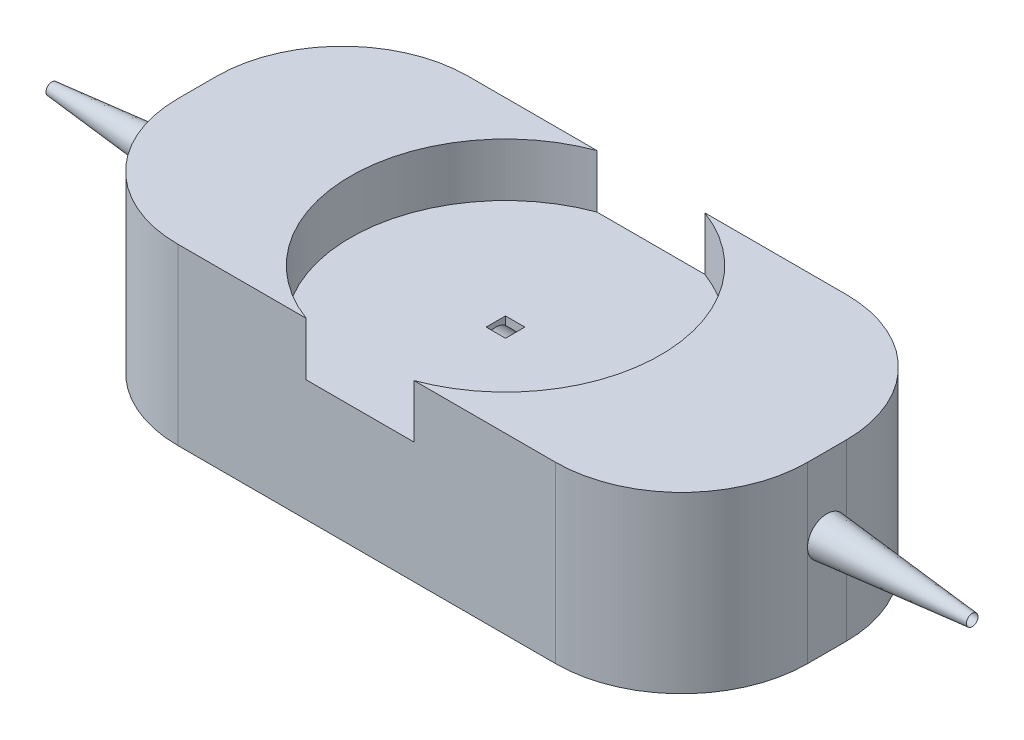
ISO-10303-21;
HEADER;
FILE_DESCRIPTION(('STEP AP214'),'2;1');
FILE_NAME('part.step','',(''),(''),'','','');
FILE_SCHEMA(('AUTOMOTIVE_DESIGN { 1 0 10303 214 1 1 1 1 }'));
ENDSEC;
DATA;
#1=APPLICATION_CONTEXT('core data for automotive mechanical design processes');
#2=APPLICATION_PROTOCOL_DEFINITION('international standard','automotive_design',2000,#1);
#3=PRODUCT_CONTEXT('',#1,'mechanical');
#4=PRODUCT('Part','Part','',(#3));
#5=PRODUCT_RELATED_PRODUCT_CATEGORY('part','',(#4));
#6=PRODUCT_DEFINITION_FORMATION('','',#4);
#7=PRODUCT_DEFINITION_CONTEXT('part definition',#1,'design');
#8=PRODUCT_DEFINITION('design','',#6,#7);
#9=PRODUCT_DEFINITION_SHAPE('','',#8);
#10=(LENGTH_UNIT() NAMED_UNIT(*) SI_UNIT(.MILLI.,.METRE.));
#11=(NAMED_UNIT(*) PLANE_ANGLE_UNIT() SI_UNIT($,.RADIAN.));
#12=(NAMED_UNIT(*) SI_UNIT($,.STERADIAN.) SOLID_ANGLE_UNIT());
#13=UNCERTAINTY_MEASURE_WITH_UNIT(LENGTH_MEASURE(1.E-05),#10,'distance_accuracy_value','');
#14=(GEOMETRIC_REPRESENTATION_CONTEXT(3) GLOBAL_UNCERTAINTY_ASSIGNED_CONTEXT((#13)) GLOBAL_UNIT_ASSIGNED_CONTEXT((#10,
#11,#12)) REPRESENTATION_CONTEXT('',''));
#15=CARTESIAN_POINT('',(0.,0.,0.));
#16=DIRECTION('',(0.,0.,1.));
#17=DIRECTION('',(1.,0.,0.));
#18=AXIS2_PLACEMENT_3D('',#15,#16,#17);
#19=CARTESIAN_POINT('',(40.001,50.4,0.));
#20=DIRECTION('',(-1.,0.,0.));
#21=DIRECTION('',(0.,0.,1.));
#22=AXIS2_PLACEMENT_3D('',#19,#20,#21);
#23=CYLINDRICAL_SURFACE('',#22,1.6);
#24=CARTESIAN_POINT('',(-25.,50.4,0.));
#25=DIRECTION('',(1.,0.,0.));
#26=DIRECTION('',(0.,0.,-1.));
#27=AXIS2_PLACEMENT_3D('',#24,#25,#26);
#28=CIRCLE('',#27,1.6);
#29=CARTESIAN_POINT('',(-25.,50.4,-1.6));
#30=VERTEX_POINT('',#29);
#31=EDGE_CURVE('E725',#30,#30,#28,.F.);
#32=ORIENTED_EDGE('',*,*,#31,.T.);
#33=EDGE_LOOP('',(#32));
#34=FACE_BOUND('',#33,.T.);
#35=DIRECTION('',(-1.,0.,0.));
#36=VECTOR('',#35,1.);
#37=CARTESIAN_POINT('',(40.001,51.6489995996798,0.999999999999832));
#38=LINE('',#37,#36);
#39=CARTESIAN_POINT('',(5.82850828649366,51.6489995996798,0.999999999999832));
#40=VERTEX_POINT('',#39);
#41=CARTESIAN_POINT('',(7.82850828649366,51.6489995996798,0.999999999999832));
#42=VERTEX_POINT('',#41);
#43=EDGE_CURVE('E256',#40,#42,#38,.F.);
#44=ORIENTED_EDGE('',*,*,#43,.T.);
#45=CARTESIAN_POINT('',(7.82850828649365,50.4,0.));
#46=DIRECTION('',(1.,0.,0.));
#47=DIRECTION('',(0.,0.,-1.));
#48=AXIS2_PLACEMENT_3D('',#45,#46,#47);
#49=CIRCLE('',#48,1.6);
#50=CARTESIAN_POINT('',(7.82850828649366,51.6489995996795,-1.00000000000017));
#51=VERTEX_POINT('',#50);
#52=EDGE_CURVE('E261',#42,#51,#49,.F.);
#53=ORIENTED_EDGE('',*,*,#52,.T.);
#54=DIRECTION('',(-1.,0.,0.));
#55=VECTOR('',#54,1.);
#56=CARTESIAN_POINT('',(40.001,51.6489995996795,-1.00000000000017));
#57=LINE('',#56,#55);
#58=CARTESIAN_POINT('',(5.82850828649366,51.6489995996795,-1.00000000000017));
#59=VERTEX_POINT('',#58);
#60=EDGE_CURVE('E248',#51,#59,#57,.T.);
#61=ORIENTED_EDGE('',*,*,#60,.T.);
#62=CARTESIAN_POINT('',(5.82850828649366,50.4,0.));
#63=DIRECTION('',(-1.,0.,0.));
#64=DIRECTION('',(0.,0.,1.));
#65=AXIS2_PLACEMENT_3D('',#62,#63,#64);
#66=CIRCLE('',#65,1.6);
#67=EDGE_CURVE('E252',#59,#40,#66,.F.);
#68=ORIENTED_EDGE('',*,*,#67,.T.);
#69=EDGE_LOOP('',(#44,#53,#61,#68));
#70=FACE_BOUND('',#69,.T.);
#71=DIRECTION('',(-1.,0.,0.));
#72=VECTOR('',#71,1.);
#73=CARTESIAN_POINT('',(40.001,49.1510004003205,-1.00000000000017));
#74=LINE('',#73,#72);
#75=CARTESIAN_POINT('',(5.82850828649366,49.1510004003205,-1.00000000000017));
#76=VERTEX_POINT('',#75);
#77=CARTESIAN_POINT('',(7.82850828649365,49.1510004003205,-1.00000000000017));
#78=VERTEX_POINT('',#77);
#79=EDGE_CURVE('E265',#76,#78,#74,.F.);
#80=ORIENTED_EDGE('',*,*,#79,.T.);
#81=CARTESIAN_POINT('',(7.82850828649366,49.1510004003202,0.999999999999832));
#82=VERTEX_POINT('',#81);
#83=EDGE_CURVE('E266',#78,#82,#49,.F.);
#84=ORIENTED_EDGE('',*,*,#83,.T.);
#85=DIRECTION('',(-1.,0.,0.));
#86=VECTOR('',#85,1.);
#87=CARTESIAN_POINT('',(40.001,49.1510004003202,0.999999999999832));
#88=LINE('',#87,#86);
#89=CARTESIAN_POINT('',(5.82850828649366,49.1510004003202,0.999999999999832));
#90=VERTEX_POINT('',#89);
#91=EDGE_CURVE('E270',#82,#90,#88,.T.);
#92=ORIENTED_EDGE('',*,*,#91,.T.);
#93=EDGE_CURVE('E257',#90,#76,#66,.F.);
#94=ORIENTED_EDGE('',*,*,#93,.T.);
#95=EDGE_LOOP('',(#80,#84,#92,#94));
#96=FACE_BOUND('',#95,.T.);
#97=CARTESIAN_POINT('',(39.9952357151676,50.4,0.));
#98=DIRECTION('',(1.,0.,0.));
#99=DIRECTION('',(0.,0.,-1.));
#100=AXIS2_PLACEMENT_3D('',#97,#98,#99);
#101=CIRCLE('',#100,1.6);
#102=CARTESIAN_POINT('',(39.9952357151676,50.4,-1.6));
#103=VERTEX_POINT('',#102);
#104=EDGE_CURVE('E56',#103,#103,#101,.F.);
#105=ORIENTED_EDGE('',*,*,#104,.F.);
#106=EDGE_LOOP('',(#105));
#107=FACE_BOUND('',#106,.T.);
#108=ADVANCED_FACE('F47',(#34,#70,#96,#107),#23,.F.);
#109=CARTESIAN_POINT('',(-25.,58.,15.));
#110=DIRECTION('',(1.,0.,0.));
#111=DIRECTION('',(0.,0.,-1.));
#112=AXIS2_PLACEMENT_3D('',#109,#110,#111);
#113=PLANE('',#112);
#114=DIRECTION('',(0.,-1.,0.));
#115=VECTOR('',#114,1.);
#116=CARTESIAN_POINT('',(-25.,58.,-1.99999999999999));
#117=LINE('',#116,#115);
#118=CARTESIAN_POINT('',(-25.,58.,-1.99999999999999));
#119=VERTEX_POINT('',#118);
#120=CARTESIAN_POINT('',(-25.,50.4,-1.99999999999999));
#121=VERTEX_POINT('',#120);
#122=EDGE_CURVE('E205',#119,#121,#117,.T.);
#123=ORIENTED_EDGE('',*,*,#122,.T.);
#124=CARTESIAN_POINT('',(-25.,50.4,0.));
#125=DIRECTION('',(1.,0.,0.));
#126=DIRECTION('',(0.,0.,-1.));
#127=AXIS2_PLACEMENT_3D('',#124,#125,#126);
#128=CIRCLE('',#127,2.);
#129=CARTESIAN_POINT('',(-25.,50.4,2.00000000000001));
#130=VERTEX_POINT('',#129);
#131=EDGE_CURVE('E62',#121,#130,#128,.T.);
#132=ORIENTED_EDGE('',*,*,#131,.T.);
#133=DIRECTION('',(0.,-1.,0.));
#134=VECTOR('',#133,1.);
#135=CARTESIAN_POINT('',(-25.,58.,2.00000000000001));
#136=LINE('',#135,#134);
#137=CARTESIAN_POINT('',(-25.,58.,2.00000000000001));
#138=VERTEX_POINT('',#137);
#139=EDGE_CURVE('E202',#130,#138,#136,.F.);
#140=ORIENTED_EDGE('',*,*,#139,.T.);
#141=DIRECTION('',(0.,0.,1.));
#142=VECTOR('',#141,1.);
#143=CARTESIAN_POINT('',(-25.,58.,15.));
#144=LINE('',#143,#142);
#145=EDGE_CURVE('E375',#119,#138,#144,.T.);
#146=ORIENTED_EDGE('',*,*,#145,.F.);
#147=EDGE_LOOP('',(#123,#132,#140,#146));
#148=FACE_BOUND('',#147,.T.);
#149=ADVANCED_FACE('F200',(#148),#113,.F.);
#150=CARTESIAN_POINT('',(0.,58.,0.));
#151=DIRECTION('',(0.,-1.,0.));
#152=DIRECTION('',(0.,0.,-1.));
#153=AXIS2_PLACEMENT_3D('',#150,#151,#152);
#154=PLANE('',#153);
#155=DIRECTION('',(-1.,0.,0.));
#156=VECTOR('',#155,1.);
#157=CARTESIAN_POINT('',(-25.,58.,-15.));
#158=LINE('',#157,#156);
#159=CARTESIAN_POINT('',(27.,58.,-15.));
#160=VERTEX_POINT('',#159);
#161=CARTESIAN_POINT('',(12.3962726493241,58.,-15.));
#162=VERTEX_POINT('',#161);
#163=EDGE_CURVE('E371',#160,#162,#158,.T.);
#164=ORIENTED_EDGE('',*,*,#163,.T.);
#165=CARTESIAN_POINT('',(6.82850828649366,58.,-1.6826817716975E-13));
#166=DIRECTION('',(0.,1.,0.));
#167=DIRECTION('',(0.,0.,1.));
#168=AXIS2_PLACEMENT_3D('',#165,#166,#167);
#169=CIRCLE('',#168,16.);
#170=CARTESIAN_POINT('',(12.3962726493232,58.,15.));
#171=VERTEX_POINT('',#170);
#172=EDGE_CURVE('E296',#171,#162,#169,.T.);
#173=ORIENTED_EDGE('',*,*,#172,.F.);
#174=DIRECTION('',(1.,0.,0.));
#175=VECTOR('',#174,1.);
#176=CARTESIAN_POINT('',(-25.,58.,15.));
#177=LINE('',#176,#175);
#178=CARTESIAN_POINT('',(27.,58.,15.));
#179=VERTEX_POINT('',#178);
#180=EDGE_CURVE('E378',#171,#179,#177,.T.);
#181=ORIENTED_EDGE('',*,*,#180,.T.);
#182=CARTESIAN_POINT('',(27.,58.,2.00000000000001));
#183=DIRECTION('',(0.,-1.,0.));
#184=DIRECTION('',(0.,0.,-1.));
#185=AXIS2_PLACEMENT_3D('',#182,#183,#184);
#186=CIRCLE('',#185,13.);
#187=CARTESIAN_POINT('',(40.,58.,2.00000000000001));
#188=VERTEX_POINT('',#187);
#189=EDGE_CURVE('E400',#179,#188,#186,.F.);
#190=ORIENTED_EDGE('',*,*,#189,.T.);
#191=DIRECTION('',(0.,0.,-1.));
#192=VECTOR('',#191,1.);
#193=CARTESIAN_POINT('',(40.,58.,15.));
#194=LINE('',#193,#192);
#195=CARTESIAN_POINT('',(40.,58.,-2.));
#196=VERTEX_POINT('',#195);
#197=EDGE_CURVE('E366',#188,#196,#194,.T.);
#198=ORIENTED_EDGE('',*,*,#197,.T.);
#199=CARTESIAN_POINT('',(27.,58.,-2.));
#200=DIRECTION('',(0.,-1.,0.));
#201=DIRECTION('',(0.,0.,-1.));
#202=AXIS2_PLACEMENT_3D('',#199,#200,#201);
#203=CIRCLE('',#202,13.);
#204=EDGE_CURVE('E216',#196,#160,#203,.F.);
#205=ORIENTED_EDGE('',*,*,#204,.T.);
#206=EDGE_LOOP('',(#164,#173,#181,#190,#198,#205));
#207=FACE_BOUND('',#206,.T.);
#208=ADVANCED_FACE('F410',(#207),#154,.F.);
#209=CARTESIAN_POINT('',(40.,58.,15.));
#210=DIRECTION('',(-1.,0.,0.));
#211=DIRECTION('',(0.,0.,1.));
#212=AXIS2_PLACEMENT_3D('',#209,#210,#211);
#213=PLANE('',#212);
#214=CARTESIAN_POINT('',(40.,50.4,0.));
#215=DIRECTION('',(-1.,0.,0.));
#216=DIRECTION('',(0.,0.,1.));
#217=AXIS2_PLACEMENT_3D('',#214,#215,#216);
#218=CIRCLE('',#217,1.99955533341565);
#219=CARTESIAN_POINT('',(40.,50.4,1.99955533341565));
#220=VERTEX_POINT('',#219);
#221=EDGE_CURVE('E11',#220,#220,#218,.F.);
#222=ORIENTED_EDGE('',*,*,#221,.F.);
#223=EDGE_LOOP('',(#222));
#224=FACE_BOUND('',#223,.T.);
#225=DIRECTION('',(0.,0.,1.));
#226=VECTOR('',#225,1.);
#227=CARTESIAN_POINT('',(40.,40.,15.));
#228=LINE('',#227,#226);
#229=CARTESIAN_POINT('',(40.,40.,-2.));
#230=VERTEX_POINT('',#229);
#231=CARTESIAN_POINT('',(40.,40.,2.00000000000001));
#232=VERTEX_POINT('',#231);
#233=EDGE_CURVE('E359',#230,#232,#228,.T.);
#234=ORIENTED_EDGE('',*,*,#233,.F.);
#235=DIRECTION('',(0.,-1.,0.));
#236=VECTOR('',#235,1.);
#237=CARTESIAN_POINT('',(40.,58.,-2.));
#238=LINE('',#237,#236);
#239=EDGE_CURVE('E395',#230,#196,#238,.F.);
#240=ORIENTED_EDGE('',*,*,#239,.T.);
#241=ORIENTED_EDGE('',*,*,#197,.F.);
#242=DIRECTION('',(0.,-1.,0.));
#243=VECTOR('',#242,1.);
#244=CARTESIAN_POINT('',(40.,58.,2.00000000000001));
#245=LINE('',#244,#243);
#246=EDGE_CURVE('E391',#188,#232,#245,.T.);
#247=ORIENTED_EDGE('',*,*,#246,.T.);
#248=EDGE_LOOP('',(#234,#240,#241,#247));
#249=FACE_BOUND('',#248,.T.);
#250=ADVANCED_FACE('F425',(#224,#249),#213,.F.);
#251=CARTESIAN_POINT('',(-25.,58.,-15.));
#252=DIRECTION('',(0.,0.,1.));
#253=DIRECTION('',(1.,0.,0.));
#254=AXIS2_PLACEMENT_3D('',#251,#252,#253);
#255=PLANE('',#254);
#256=DIRECTION('',(-1.,0.,0.));
#257=VECTOR('',#256,1.);
#258=CARTESIAN_POINT('',(-25.,52.5,-15.));
#259=LINE('',#258,#257);
#260=CARTESIAN_POINT('',(12.3962726493241,52.5,-15.));
#261=VERTEX_POINT('',#260);
#262=CARTESIAN_POINT('',(1.26074392366317,52.5,-15.));
#263=VERTEX_POINT('',#262);
#264=EDGE_CURVE('E340',#261,#263,#259,.T.);
#265=ORIENTED_EDGE('',*,*,#264,.F.);
#266=DIRECTION('',(0.,1.,0.));
#267=VECTOR('',#266,1.);
#268=CARTESIAN_POINT('',(12.3962726493241,52.5,-15.));
#269=LINE('',#268,#267);
#270=EDGE_CURVE('E336',#261,#162,#269,.T.);
#271=ORIENTED_EDGE('',*,*,#270,.T.);
#272=ORIENTED_EDGE('',*,*,#163,.F.);
#273=DIRECTION('',(0.,-1.,0.));
#274=VECTOR('',#273,1.);
#275=CARTESIAN_POINT('',(27.,58.,-15.));
#276=LINE('',#275,#274);
#277=CARTESIAN_POINT('',(27.,40.,-15.));
#278=VERTEX_POINT('',#277);
#279=EDGE_CURVE('E387',#160,#278,#276,.T.);
#280=ORIENTED_EDGE('',*,*,#279,.T.);
#281=DIRECTION('',(1.,0.,0.));
#282=VECTOR('',#281,1.);
#283=CARTESIAN_POINT('',(-25.,40.,-15.));
#284=LINE('',#283,#282);
#285=CARTESIAN_POINT('',(-12.,40.,-15.));
#286=VERTEX_POINT('',#285);
#287=EDGE_CURVE('E356',#286,#278,#284,.T.);
#288=ORIENTED_EDGE('',*,*,#287,.F.);
#289=DIRECTION('',(0.,-1.,0.));
#290=VECTOR('',#289,1.);
#291=CARTESIAN_POINT('',(-12.,58.,-15.));
#292=LINE('',#291,#290);
#293=CARTESIAN_POINT('',(-12.,58.,-15.));
#294=VERTEX_POINT('',#293);
#295=EDGE_CURVE('E383',#286,#294,#292,.F.);
#296=ORIENTED_EDGE('',*,*,#295,.T.);
#297=CARTESIAN_POINT('',(1.26074392366317,58.,-15.));
#298=VERTEX_POINT('',#297);
#299=EDGE_CURVE('E370',#298,#294,#158,.T.);
#300=ORIENTED_EDGE('',*,*,#299,.F.);
#301=DIRECTION('',(0.,1.,0.));
#302=VECTOR('',#301,1.);
#303=CARTESIAN_POINT('',(1.26074392366316,52.5,-15.));
#304=LINE('',#303,#302);
#305=EDGE_CURVE('E332',#298,#263,#304,.F.);
#306=ORIENTED_EDGE('',*,*,#305,.T.);
#307=EDGE_LOOP('',(#265,#271,#272,#280,#288,#296,#300,#306));
#308=FACE_BOUND('',#307,.T.);
#309=ADVANCED_FACE('F418',(#308),#255,.F.);
#310=CARTESIAN_POINT('',(-25.,40.,2.00000000000001));
#311=VERTEX_POINT('',#310);
#312=EDGE_CURVE('E212',#311,#130,#136,.F.);
#313=ORIENTED_EDGE('',*,*,#312,.T.);
#314=EDGE_CURVE('E189',#130,#121,#128,.T.);
#315=ORIENTED_EDGE('',*,*,#314,.T.);
#316=CARTESIAN_POINT('',(-25.,40.,-1.99999999999999));
#317=VERTEX_POINT('',#316);
#318=EDGE_CURVE('E223',#121,#317,#117,.T.);
#319=ORIENTED_EDGE('',*,*,#318,.T.);
#320=DIRECTION('',(0.,0.,-1.));
#321=VECTOR('',#320,1.);
#322=CARTESIAN_POINT('',(-25.,40.,15.));
#323=LINE('',#322,#321);
#324=EDGE_CURVE('E221',#311,#317,#323,.T.);
#325=ORIENTED_EDGE('',*,*,#324,.F.);
#326=EDGE_LOOP('',(#313,#315,#319,#325));
#327=FACE_BOUND('',#326,.T.);
#328=ADVANCED_FACE('F219',(#327),#113,.F.);
#329=CARTESIAN_POINT('',(-25.,58.,15.));
#330=DIRECTION('',(0.,0.,-1.));
#331=DIRECTION('',(-1.,0.,0.));
#332=AXIS2_PLACEMENT_3D('',#329,#330,#331);
#333=PLANE('',#332);
#334=DIRECTION('',(1.,0.,0.));
#335=VECTOR('',#334,1.);
#336=CARTESIAN_POINT('',(-25.,52.5,15.));
#337=LINE('',#336,#335);
#338=CARTESIAN_POINT('',(1.2607439236641,52.5,15.));
#339=VERTEX_POINT('',#338);
#340=CARTESIAN_POINT('',(12.3962726493232,52.5,15.));
#341=VERTEX_POINT('',#340);
#342=EDGE_CURVE('E245',#339,#341,#337,.T.);
#343=ORIENTED_EDGE('',*,*,#342,.F.);
#344=DIRECTION('',(0.,1.,0.));
#345=VECTOR('',#344,1.);
#346=CARTESIAN_POINT('',(1.26074392366409,52.5,15.));
#347=LINE('',#346,#345);
#348=CARTESIAN_POINT('',(1.2607439236641,58.,15.));
#349=VERTEX_POINT('',#348);
#350=EDGE_CURVE('E328',#339,#349,#347,.T.);
#351=ORIENTED_EDGE('',*,*,#350,.T.);
#352=CARTESIAN_POINT('',(-12.,58.,15.));
#353=VERTEX_POINT('',#352);
#354=EDGE_CURVE('E379',#353,#349,#177,.T.);
#355=ORIENTED_EDGE('',*,*,#354,.F.);
#356=DIRECTION('',(0.,-1.,0.));
#357=VECTOR('',#356,1.);
#358=CARTESIAN_POINT('',(-12.,58.,15.));
#359=LINE('',#358,#357);
#360=CARTESIAN_POINT('',(-12.,40.,15.));
#361=VERTEX_POINT('',#360);
#362=EDGE_CURVE('E230',#353,#361,#359,.T.);
#363=ORIENTED_EDGE('',*,*,#362,.T.);
#364=DIRECTION('',(-1.,0.,0.));
#365=VECTOR('',#364,1.);
#366=CARTESIAN_POINT('',(-25.,40.,15.));
#367=LINE('',#366,#365);
#368=CARTESIAN_POINT('',(27.,40.,15.));
#369=VERTEX_POINT('',#368);
#370=EDGE_CURVE('E343',#369,#361,#367,.T.);
#371=ORIENTED_EDGE('',*,*,#370,.F.);
#372=DIRECTION('',(0.,-1.,0.));
#373=VECTOR('',#372,1.);
#374=CARTESIAN_POINT('',(27.,58.,15.));
#375=LINE('',#374,#373);
#376=EDGE_CURVE('E234',#369,#179,#375,.F.);
#377=ORIENTED_EDGE('',*,*,#376,.T.);
#378=ORIENTED_EDGE('',*,*,#180,.F.);
#379=DIRECTION('',(0.,1.,0.));
#380=VECTOR('',#379,1.);
#381=CARTESIAN_POINT('',(12.3962726493232,52.5,15.));
#382=LINE('',#381,#380);
#383=EDGE_CURVE('E323',#171,#341,#382,.F.);
#384=ORIENTED_EDGE('',*,*,#383,.T.);
#385=EDGE_LOOP('',(#343,#351,#355,#363,#371,#377,#378,#384));
#386=FACE_BOUND('',#385,.T.);
#387=ADVANCED_FACE('F434',(#386),#333,.F.);
#388=CARTESIAN_POINT('',(27.,58.,-2.));
#389=DIRECTION('',(0.,-1.,0.));
#390=DIRECTION('',(0.,0.,-1.));
#391=AXIS2_PLACEMENT_3D('',#388,#389,#390);
#392=CYLINDRICAL_SURFACE('',#391,13.);
#393=ORIENTED_EDGE('',*,*,#239,.F.);
#394=CARTESIAN_POINT('',(27.,40.,-2.));
#395=DIRECTION('',(0.,-1.,0.));
#396=DIRECTION('',(0.,0.,-1.));
#397=AXIS2_PLACEMENT_3D('',#394,#395,#396);
#398=CIRCLE('',#397,13.);
#399=EDGE_CURVE('E362',#230,#278,#398,.F.);
#400=ORIENTED_EDGE('',*,*,#399,.T.);
#401=ORIENTED_EDGE('',*,*,#279,.F.);
#402=ORIENTED_EDGE('',*,*,#204,.F.);
#403=EDGE_LOOP('',(#393,#400,#401,#402));
#404=FACE_BOUND('',#403,.T.);
#405=ADVANCED_FACE('F420',(#404),#392,.T.);
#406=CARTESIAN_POINT('',(-12.,58.,-1.99999999999999));
#407=DIRECTION('',(0.,-1.,0.));
#408=DIRECTION('',(0.,0.,-1.));
#409=AXIS2_PLACEMENT_3D('',#406,#407,#408);
#410=CYLINDRICAL_SURFACE('',#409,13.);
#411=ORIENTED_EDGE('',*,*,#295,.F.);
#412=CARTESIAN_POINT('',(-12.,40.,-1.99999999999999));
#413=DIRECTION('',(0.,-1.,0.));
#414=DIRECTION('',(0.,0.,-1.));
#415=AXIS2_PLACEMENT_3D('',#412,#413,#414);
#416=CIRCLE('',#415,13.);
#417=EDGE_CURVE('E352',#286,#317,#416,.F.);
#418=ORIENTED_EDGE('',*,*,#417,.T.);
#419=ORIENTED_EDGE('',*,*,#318,.F.);
#420=ORIENTED_EDGE('',*,*,#122,.F.);
#421=CARTESIAN_POINT('',(-12.,58.,-1.99999999999999));
#422=DIRECTION('',(0.,-1.,0.));
#423=DIRECTION('',(0.,0.,-1.));
#424=AXIS2_PLACEMENT_3D('',#421,#422,#423);
#425=CIRCLE('',#424,13.);
#426=EDGE_CURVE('E402',#294,#119,#425,.F.);
#427=ORIENTED_EDGE('',*,*,#426,.F.);
#428=EDGE_LOOP('',(#411,#418,#419,#420,#427));
#429=FACE_BOUND('',#428,.T.);
#430=ADVANCED_FACE('F439',(#429),#410,.T.);
#431=CARTESIAN_POINT('',(27.,58.,2.00000000000001));
#432=DIRECTION('',(0.,-1.,0.));
#433=DIRECTION('',(0.,0.,-1.));
#434=AXIS2_PLACEMENT_3D('',#431,#432,#433);
#435=CYLINDRICAL_SURFACE('',#434,13.);
#436=ORIENTED_EDGE('',*,*,#376,.F.);
#437=CARTESIAN_POINT('',(27.,40.,2.00000000000001));
#438=DIRECTION('',(0.,-1.,0.));
#439=DIRECTION('',(0.,0.,-1.));
#440=AXIS2_PLACEMENT_3D('',#437,#438,#439);
#441=CIRCLE('',#440,13.);
#442=EDGE_CURVE('E348',#369,#232,#441,.F.);
#443=ORIENTED_EDGE('',*,*,#442,.T.);
#444=ORIENTED_EDGE('',*,*,#246,.F.);
#445=ORIENTED_EDGE('',*,*,#189,.F.);
#446=EDGE_LOOP('',(#436,#443,#444,#445));
#447=FACE_BOUND('',#446,.T.);
#448=ADVANCED_FACE('F430',(#447),#435,.T.);
#449=CARTESIAN_POINT('',(-12.,58.,2.00000000000001));
#450=DIRECTION('',(0.,-1.,0.));
#451=DIRECTION('',(0.,0.,-1.));
#452=AXIS2_PLACEMENT_3D('',#449,#450,#451);
#453=CYLINDRICAL_SURFACE('',#452,13.);
#454=ORIENTED_EDGE('',*,*,#312,.F.);
#455=CARTESIAN_POINT('',(-12.,40.,2.00000000000001));
#456=DIRECTION('',(0.,-1.,0.));
#457=DIRECTION('',(0.,0.,-1.));
#458=AXIS2_PLACEMENT_3D('',#455,#456,#457);
#459=CIRCLE('',#458,13.);
#460=EDGE_CURVE('E238',#311,#361,#459,.F.);
#461=ORIENTED_EDGE('',*,*,#460,.T.);
#462=ORIENTED_EDGE('',*,*,#362,.F.);
#463=CARTESIAN_POINT('',(-12.,58.,2.00000000000001));
#464=DIRECTION('',(0.,-1.,0.));
#465=DIRECTION('',(0.,0.,-1.));
#466=AXIS2_PLACEMENT_3D('',#463,#464,#465);
#467=CIRCLE('',#466,13.);
#468=EDGE_CURVE('E214',#138,#353,#467,.F.);
#469=ORIENTED_EDGE('',*,*,#468,.F.);
#470=ORIENTED_EDGE('',*,*,#139,.F.);
#471=EDGE_LOOP('',(#454,#461,#462,#469,#470));
#472=FACE_BOUND('',#471,.T.);
#473=ADVANCED_FACE('F49',(#472),#453,.T.);
#474=ORIENTED_EDGE('',*,*,#354,.T.);
#475=CARTESIAN_POINT('',(6.82850828649366,58.,-1.6826817716975E-13));
#476=DIRECTION('',(0.,-1.,0.));
#477=DIRECTION('',(0.,0.,-1.));
#478=AXIS2_PLACEMENT_3D('',#475,#476,#477);
#479=CIRCLE('',#478,16.);
#480=EDGE_CURVE('E241',#349,#298,#479,.T.);
#481=ORIENTED_EDGE('',*,*,#480,.T.);
#482=ORIENTED_EDGE('',*,*,#299,.T.);
#483=ORIENTED_EDGE('',*,*,#426,.T.);
#484=ORIENTED_EDGE('',*,*,#145,.T.);
#485=ORIENTED_EDGE('',*,*,#468,.T.);
#486=EDGE_LOOP('',(#474,#481,#482,#483,#484,#485));
#487=FACE_BOUND('',#486,.T.);
#488=ADVANCED_FACE('F533',(#487),#154,.F.);
#489=CARTESIAN_POINT('',(0.,40.,0.));
#490=DIRECTION('',(0.,-1.,0.));
#491=DIRECTION('',(0.,0.,-1.));
#492=AXIS2_PLACEMENT_3D('',#489,#490,#491);
#493=PLANE('',#492);
#494=ORIENTED_EDGE('',*,*,#233,.T.);
#495=ORIENTED_EDGE('',*,*,#442,.F.);
#496=ORIENTED_EDGE('',*,*,#370,.T.);
#497=ORIENTED_EDGE('',*,*,#460,.F.);
#498=ORIENTED_EDGE('',*,*,#324,.T.);
#499=ORIENTED_EDGE('',*,*,#417,.F.);
#500=ORIENTED_EDGE('',*,*,#287,.T.);
#501=ORIENTED_EDGE('',*,*,#399,.F.);
#502=EDGE_LOOP('',(#494,#495,#496,#497,#498,#499,#500,#501));
#503=FACE_BOUND('',#502,.T.);
#504=ADVANCED_FACE('F423',(#503),#493,.T.);
#505=CARTESIAN_POINT('',(6.82850828649366,52.5,-1.6826817716975E-13));
#506=DIRECTION('',(0.,1.,0.));
#507=DIRECTION('',(0.,0.,1.));
#508=AXIS2_PLACEMENT_3D('',#505,#506,#507);
#509=PLANE('',#508);
#510=DIRECTION('',(0.,0.,-1.));
#511=VECTOR('',#510,1.);
#512=CARTESIAN_POINT('',(7.82850828649366,52.5,0.999999999999832));
#513=LINE('',#512,#511);
#514=CARTESIAN_POINT('',(7.82850828649366,52.5,0.999999999999832));
#515=VERTEX_POINT('',#514);
#516=CARTESIAN_POINT('',(7.82850828649366,52.5,-1.00000000000017));
#517=VERTEX_POINT('',#516);
#518=EDGE_CURVE('E70',#515,#517,#513,.T.);
#519=ORIENTED_EDGE('',*,*,#518,.F.);
#520=DIRECTION('',(1.,0.,0.));
#521=VECTOR('',#520,1.);
#522=CARTESIAN_POINT('',(5.82850828649366,52.5,0.999999999999832));
#523=LINE('',#522,#521);
#524=CARTESIAN_POINT('',(5.82850828649366,52.5,0.999999999999832));
#525=VERTEX_POINT('',#524);
#526=EDGE_CURVE('E306',#525,#515,#523,.T.);
#527=ORIENTED_EDGE('',*,*,#526,.F.);
#528=DIRECTION('',(0.,0.,1.));
#529=VECTOR('',#528,1.);
#530=CARTESIAN_POINT('',(5.82850828649366,52.5,0.999999999999832));
#531=LINE('',#530,#529);
#532=CARTESIAN_POINT('',(5.82850828649366,52.5,-1.00000000000017));
#533=VERTEX_POINT('',#532);
#534=EDGE_CURVE('E720',#533,#525,#531,.T.);
#535=ORIENTED_EDGE('',*,*,#534,.F.);
#536=DIRECTION('',(-1.,0.,0.));
#537=VECTOR('',#536,1.);
#538=CARTESIAN_POINT('',(5.82850828649366,52.5,-1.00000000000017));
#539=LINE('',#538,#537);
#540=EDGE_CURVE('E723',#517,#533,#539,.T.);
#541=ORIENTED_EDGE('',*,*,#540,.F.);
#542=EDGE_LOOP('',(#519,#527,#535,#541));
#543=FACE_BOUND('',#542,.T.);
#544=ORIENTED_EDGE('',*,*,#264,.T.);
#545=CARTESIAN_POINT('',(6.82850828649366,52.5,-1.6826817716975E-13));
#546=DIRECTION('',(0.,1.,0.));
#547=DIRECTION('',(0.,0.,1.));
#548=AXIS2_PLACEMENT_3D('',#545,#546,#547);
#549=CIRCLE('',#548,16.);
#550=EDGE_CURVE('E301',#263,#339,#549,.T.);
#551=ORIENTED_EDGE('',*,*,#550,.T.);
#552=ORIENTED_EDGE('',*,*,#342,.T.);
#553=EDGE_CURVE('E320',#341,#261,#549,.T.);
#554=ORIENTED_EDGE('',*,*,#553,.T.);
#555=EDGE_LOOP('',(#544,#551,#552,#554));
#556=FACE_BOUND('',#555,.T.);
#557=ADVANCED_FACE('F446',(#543,#556),#509,.T.);
#558=CARTESIAN_POINT('',(6.82850828649366,52.5,-1.6826817716975E-13));
#559=DIRECTION('',(0.,1.,0.));
#560=DIRECTION('',(0.,0.,1.));
#561=AXIS2_PLACEMENT_3D('',#558,#559,#560);
#562=CYLINDRICAL_SURFACE('',#561,16.);
#563=ORIENTED_EDGE('',*,*,#553,.F.);
#564=ORIENTED_EDGE('',*,*,#383,.F.);
#565=ORIENTED_EDGE('',*,*,#172,.T.);
#566=ORIENTED_EDGE('',*,*,#270,.F.);
#567=EDGE_LOOP('',(#563,#564,#565,#566));
#568=FACE_BOUND('',#567,.T.);
#569=ADVANCED_FACE('F450',(#568),#562,.F.);
#570=ORIENTED_EDGE('',*,*,#480,.F.);
#571=ORIENTED_EDGE('',*,*,#350,.F.);
#572=ORIENTED_EDGE('',*,*,#550,.F.);
#573=ORIENTED_EDGE('',*,*,#305,.F.);
#574=EDGE_LOOP('',(#570,#571,#572,#573));
#575=FACE_BOUND('',#574,.T.);
#576=ADVANCED_FACE('F453',(#575),#562,.F.);
#577=CARTESIAN_POINT('',(5.82850828649366,44.5,-1.00000000000017));
#578=DIRECTION('',(0.,0.,-1.));
#579=DIRECTION('',(-1.,0.,0.));
#580=AXIS2_PLACEMENT_3D('',#577,#578,#579);
#581=PLANE('',#580);
#582=DIRECTION('',(0.,1.,0.));
#583=VECTOR('',#582,1.);
#584=CARTESIAN_POINT('',(7.82850828649366,44.5,-1.00000000000017));
#585=LINE('',#584,#583);
#586=EDGE_CURVE('E319',#51,#517,#585,.T.);
#587=ORIENTED_EDGE('',*,*,#586,.T.);
#588=ORIENTED_EDGE('',*,*,#540,.T.);
#589=DIRECTION('',(0.,1.,0.));
#590=VECTOR('',#589,1.);
#591=CARTESIAN_POINT('',(5.82850828649366,44.5,-1.00000000000017));
#592=LINE('',#591,#590);
#593=EDGE_CURVE('E316',#59,#533,#592,.T.);
#594=ORIENTED_EDGE('',*,*,#593,.F.);
#595=ORIENTED_EDGE('',*,*,#60,.F.);
#596=EDGE_LOOP('',(#587,#588,#594,#595));
#597=FACE_BOUND('',#596,.T.);
#598=ADVANCED_FACE('F459',(#597),#581,.F.);
#599=CARTESIAN_POINT('',(5.82850828649366,44.5,0.999999999999832));
#600=DIRECTION('',(-1.,0.,0.));
#601=DIRECTION('',(0.,0.,1.));
#602=AXIS2_PLACEMENT_3D('',#599,#600,#601);
#603=PLANE('',#602);
#604=ORIENTED_EDGE('',*,*,#593,.T.);
#605=ORIENTED_EDGE('',*,*,#534,.T.);
#606=DIRECTION('',(0.,1.,0.));
#607=VECTOR('',#606,1.);
#608=CARTESIAN_POINT('',(5.82850828649366,44.5,0.999999999999832));
#609=LINE('',#608,#607);
#610=EDGE_CURVE('E311',#40,#525,#609,.T.);
#611=ORIENTED_EDGE('',*,*,#610,.F.);
#612=ORIENTED_EDGE('',*,*,#67,.F.);
#613=EDGE_LOOP('',(#604,#605,#611,#612));
#614=FACE_BOUND('',#613,.T.);
#615=ADVANCED_FACE('F489',(#614),#603,.F.);
#616=CARTESIAN_POINT('',(5.82850828649366,44.5,0.999999999999832));
#617=DIRECTION('',(0.,0.,1.));
#618=DIRECTION('',(1.,0.,0.));
#619=AXIS2_PLACEMENT_3D('',#616,#617,#618);
#620=PLANE('',#619);
#621=ORIENTED_EDGE('',*,*,#610,.T.);
#622=ORIENTED_EDGE('',*,*,#526,.T.);
#623=DIRECTION('',(0.,1.,0.));
#624=VECTOR('',#623,1.);
#625=CARTESIAN_POINT('',(7.82850828649366,44.5,0.999999999999832));
#626=LINE('',#625,#624);
#627=EDGE_CURVE('E297',#42,#515,#626,.T.);
#628=ORIENTED_EDGE('',*,*,#627,.F.);
#629=ORIENTED_EDGE('',*,*,#43,.F.);
#630=EDGE_LOOP('',(#621,#622,#628,#629));
#631=FACE_BOUND('',#630,.T.);
#632=ADVANCED_FACE('F490',(#631),#620,.F.);
#633=CARTESIAN_POINT('',(7.82850828649366,44.5,0.999999999999832));
#634=DIRECTION('',(1.,0.,0.));
#635=DIRECTION('',(0.,0.,-1.));
#636=AXIS2_PLACEMENT_3D('',#633,#634,#635);
#637=PLANE('',#636);
#638=ORIENTED_EDGE('',*,*,#627,.T.);
#639=ORIENTED_EDGE('',*,*,#518,.T.);
#640=ORIENTED_EDGE('',*,*,#586,.F.);
#641=ORIENTED_EDGE('',*,*,#52,.F.);
#642=EDGE_LOOP('',(#638,#639,#640,#641));
#643=FACE_BOUND('',#642,.T.);
#644=ADVANCED_FACE('F479',(#643),#637,.F.);
#645=CARTESIAN_POINT('',(7.82850828649366,44.5,-1.00000000000017));
#646=VERTEX_POINT('',#645);
#647=EDGE_CURVE('E287',#646,#78,#585,.T.);
#648=ORIENTED_EDGE('',*,*,#647,.F.);
#649=DIRECTION('',(0.,0.,-1.));
#650=VECTOR('',#649,1.);
#651=CARTESIAN_POINT('',(7.82850828649366,44.5,0.999999999999832));
#652=LINE('',#651,#650);
#653=CARTESIAN_POINT('',(7.82850828649366,44.5,0.999999999999832));
#654=VERTEX_POINT('',#653);
#655=EDGE_CURVE('E291',#654,#646,#652,.T.);
#656=ORIENTED_EDGE('',*,*,#655,.F.);
#657=EDGE_CURVE('E289',#654,#82,#626,.T.);
#658=ORIENTED_EDGE('',*,*,#657,.T.);
#659=ORIENTED_EDGE('',*,*,#83,.F.);
#660=EDGE_LOOP('',(#648,#656,#658,#659));
#661=FACE_BOUND('',#660,.T.);
#662=ADVANCED_FACE('F285',(#661),#637,.F.);
#663=ORIENTED_EDGE('',*,*,#657,.F.);
#664=DIRECTION('',(1.,0.,0.));
#665=VECTOR('',#664,1.);
#666=CARTESIAN_POINT('',(5.82850828649366,44.5,0.999999999999832));
#667=LINE('',#666,#665);
#668=CARTESIAN_POINT('',(5.82850828649366,44.5,0.999999999999832));
#669=VERTEX_POINT('',#668);
#670=EDGE_CURVE('E732',#669,#654,#667,.T.);
#671=ORIENTED_EDGE('',*,*,#670,.F.);
#672=EDGE_CURVE('E303',#669,#90,#609,.T.);
#673=ORIENTED_EDGE('',*,*,#672,.T.);
#674=ORIENTED_EDGE('',*,*,#91,.F.);
#675=EDGE_LOOP('',(#663,#671,#673,#674));
#676=FACE_BOUND('',#675,.T.);
#677=ADVANCED_FACE('F478',(#676),#620,.F.);
#678=ORIENTED_EDGE('',*,*,#672,.F.);
#679=DIRECTION('',(0.,0.,1.));
#680=VECTOR('',#679,1.);
#681=CARTESIAN_POINT('',(5.82850828649366,44.5,0.999999999999832));
#682=LINE('',#681,#680);
#683=CARTESIAN_POINT('',(5.82850828649366,44.5,-1.00000000000017));
#684=VERTEX_POINT('',#683);
#685=EDGE_CURVE('E739',#684,#669,#682,.T.);
#686=ORIENTED_EDGE('',*,*,#685,.F.);
#687=EDGE_CURVE('E312',#684,#76,#592,.T.);
#688=ORIENTED_EDGE('',*,*,#687,.T.);
#689=ORIENTED_EDGE('',*,*,#93,.F.);
#690=EDGE_LOOP('',(#678,#686,#688,#689));
#691=FACE_BOUND('',#690,.T.);
#692=ADVANCED_FACE('F484',(#691),#603,.F.);
#693=ORIENTED_EDGE('',*,*,#687,.F.);
#694=DIRECTION('',(-1.,0.,0.));
#695=VECTOR('',#694,1.);
#696=CARTESIAN_POINT('',(5.82850828649366,44.5,-1.00000000000017));
#697=LINE('',#696,#695);
#698=EDGE_CURVE('E742',#646,#684,#697,.T.);
#699=ORIENTED_EDGE('',*,*,#698,.F.);
#700=ORIENTED_EDGE('',*,*,#647,.T.);
#701=ORIENTED_EDGE('',*,*,#79,.F.);
#702=EDGE_LOOP('',(#693,#699,#700,#701));
#703=FACE_BOUND('',#702,.T.);
#704=ADVANCED_FACE('F480',(#703),#581,.F.);
#705=CARTESIAN_POINT('',(0.,44.5,0.));
#706=DIRECTION('',(0.,-1.,0.));
#707=DIRECTION('',(0.,0.,-1.));
#708=AXIS2_PLACEMENT_3D('',#705,#706,#707);
#709=PLANE('',#708);
#710=ORIENTED_EDGE('',*,*,#655,.T.);
#711=ORIENTED_EDGE('',*,*,#698,.T.);
#712=ORIENTED_EDGE('',*,*,#685,.T.);
#713=ORIENTED_EDGE('',*,*,#670,.T.);
#714=EDGE_LOOP('',(#710,#711,#712,#713));
#715=FACE_BOUND('',#714,.T.);
#716=ADVANCED_FACE('F483',(#715),#709,.F.);
#717=CARTESIAN_POINT('',(-25.,51.,0.));
#718=DIRECTION('',(1.,0.,0.));
#719=DIRECTION('',(0.,0.,-1.));
#720=AXIS2_PLACEMENT_3D('',#717,#718,#719);
#721=PLANE('',#720);
#722=CARTESIAN_POINT('',(-25.,50.4,0.));
#723=DIRECTION('',(1.,0.,0.));
#724=DIRECTION('',(0.,0.,-1.));
#725=AXIS2_PLACEMENT_3D('',#722,#723,#724);
#726=CIRCLE('',#725,0.600000000000003);
#727=CARTESIAN_POINT('',(-25.,50.4,-0.600000000000003));
#728=VERTEX_POINT('',#727);
#729=EDGE_CURVE('E207',#728,#728,#726,.T.);
#730=ORIENTED_EDGE('',*,*,#729,.F.);
#731=EDGE_LOOP('',(#730));
#732=FACE_BOUND('',#731,.T.);
#733=ORIENTED_EDGE('',*,*,#31,.F.);
#734=EDGE_LOOP('',(#733));
#735=FACE_BOUND('',#734,.T.);
#736=ADVANCED_FACE('F496',(#732,#735),#721,.T.);
#737=CARTESIAN_POINT('',(-25.,50.4,0.));
#738=DIRECTION('',(1.,0.,0.));
#739=DIRECTION('',(0.,0.,-1.));
#740=AXIS2_PLACEMENT_3D('',#737,#738,#739);
#741=CYLINDRICAL_SURFACE('',#740,0.600000000000003);
#742=ORIENTED_EDGE('',*,*,#729,.T.);
#743=EDGE_LOOP('',(#742));
#744=FACE_BOUND('',#743,.T.);
#745=CARTESIAN_POINT('',(-40.,50.4,0.));
#746=DIRECTION('',(1.,0.,0.));
#747=DIRECTION('',(0.,0.,-1.));
#748=AXIS2_PLACEMENT_3D('',#745,#746,#747);
#749=CIRCLE('',#748,0.600000000000003);
#750=CARTESIAN_POINT('',(-40.,50.4,-0.600000000000003));
#751=VERTEX_POINT('',#750);
#752=EDGE_CURVE('E195',#751,#751,#749,.T.);
#753=ORIENTED_EDGE('',*,*,#752,.F.);
#754=EDGE_LOOP('',(#753));
#755=FACE_BOUND('',#754,.T.);
#756=ADVANCED_FACE('F498',(#744,#755),#741,.F.);
#757=CARTESIAN_POINT('',(-25.,50.4,0.));
#758=DIRECTION('',(1.,0.,0.));
#759=DIRECTION('',(0.,0.,-1.));
#760=AXIS2_PLACEMENT_3D('',#757,#758,#759);
#761=CONICAL_SURFACE('',#760,2.,0.0930637287244178);
#762=ORIENTED_EDGE('',*,*,#752,.T.);
#763=EDGE_LOOP('',(#762));
#764=FACE_BOUND('',#763,.T.);
#765=ORIENTED_EDGE('',*,*,#131,.F.);
#766=ORIENTED_EDGE('',*,*,#314,.F.);
#767=EDGE_LOOP('',(#765,#766));
#768=FACE_BOUND('',#767,.T.);
#769=ADVANCED_FACE('F190',(#764,#768),#761,.T.);
#770=CARTESIAN_POINT('',(54.9952357151676,50.4,0.));
#771=DIRECTION('',(-1.,0.,0.));
#772=DIRECTION('',(0.,0.,1.));
#773=AXIS2_PLACEMENT_3D('',#770,#771,#772);
#774=CONICAL_SURFACE('',#773,0.600000000000003,0.0930637287244179);
#775=CARTESIAN_POINT('',(54.9952357151676,50.4,0.));
#776=DIRECTION('',(-1.,0.,0.));
#777=DIRECTION('',(0.,0.,1.));
#778=AXIS2_PLACEMENT_3D('',#775,#776,#777);
#779=CIRCLE('',#778,0.600000000000003);
#780=CARTESIAN_POINT('',(54.9952357151676,50.4,0.600000000000003));
#781=VERTEX_POINT('',#780);
#782=EDGE_CURVE('E523',#781,#781,#779,.T.);
#783=CARTESIAN_POINT('',(54.9952357151676,50.4,0.600000000000003));
#784=CARTESIAN_POINT('',(54.8390353431346,50.4,0.61457870138975));
#785=CARTESIAN_POINT('',(54.6828349711016,50.4,0.629157402779496));
#786=CARTESIAN_POINT('',(54.3704342270356,50.4,0.658314805558988));
#787=CARTESIAN_POINT('',(54.2142338550026,50.4,0.672893506948734));
#788=CARTESIAN_POINT('',(53.9018331109366,50.4,0.702050909728227));
#789=CARTESIAN_POINT('',(53.7456327389036,50.4,0.716629611117973));
#790=CARTESIAN_POINT('',(53.4332319948376,50.4,0.745787013897466));
#791=CARTESIAN_POINT('',(53.2770316228046,50.4,0.760365715287212));
#792=CARTESIAN_POINT('',(52.9646308787387,50.4,0.789523118066705));
#793=CARTESIAN_POINT('',(52.8084305067057,50.4,0.804101819456451));
#794=CARTESIAN_POINT('',(52.4960297626397,50.4,0.833259222235944));
#795=CARTESIAN_POINT('',(52.3398293906067,50.4,0.84783792362569));
#796=CARTESIAN_POINT('',(52.0274286465407,50.4,0.876995326405182));
#797=CARTESIAN_POINT('',(51.8712282745077,50.4,0.891574027794929));
#798=CARTESIAN_POINT('',(51.5588275304417,50.4,0.920731430574421));
#799=CARTESIAN_POINT('',(51.4026271584087,50.4,0.935310131964168));
#800=CARTESIAN_POINT('',(51.0902264143427,50.4,0.96446753474366));
#801=CARTESIAN_POINT('',(50.9340260423097,50.4,0.979046236133406));
#802=CARTESIAN_POINT('',(50.6216252982437,50.4,1.0082036389129));
#803=CARTESIAN_POINT('',(50.4654249262107,50.4,1.02278234030265));
#804=CARTESIAN_POINT('',(50.1530241821447,50.4,1.05193974308214));
#805=CARTESIAN_POINT('',(49.9968238101117,50.4,1.06651844447188));
#806=CARTESIAN_POINT('',(49.6844230660457,50.4,1.09567584725138));
#807=CARTESIAN_POINT('',(49.5282226940127,50.4,1.11025454864112));
#808=CARTESIAN_POINT('',(49.2158219499468,50.4,1.13941195142062));
#809=CARTESIAN_POINT('',(49.0596215779138,50.4,1.15399065281036));
#810=CARTESIAN_POINT('',(48.7472208338478,50.4,1.18314805558985));
#811=CARTESIAN_POINT('',(48.5910204618148,50.4,1.1977267569796));
#812=CARTESIAN_POINT('',(48.2786197177488,50.4,1.22688415975909));
#813=CARTESIAN_POINT('',(48.1224193457158,50.4,1.24146286114884));
#814=CARTESIAN_POINT('',(47.8100186016498,50.4,1.27062026392833));
#815=CARTESIAN_POINT('',(47.6538182296168,50.4,1.28519896531808));
#816=CARTESIAN_POINT('',(47.3414174855508,50.4,1.31435636809757));
#817=CARTESIAN_POINT('',(47.1852171135178,50.4,1.32893506948732));
#818=CARTESIAN_POINT('',(46.8728163694518,50.4,1.35809247226681));
#819=CARTESIAN_POINT('',(46.7166159974188,50.4,1.37267117365656));
#820=CARTESIAN_POINT('',(46.4042152533528,50.4,1.40182857643605));
#821=CARTESIAN_POINT('',(46.2480148813198,50.4,1.41640727782579));
#822=CARTESIAN_POINT('',(45.9356141372538,50.4,1.44556468060529));
#823=CARTESIAN_POINT('',(45.7794137652209,50.4,1.46014338199503));
#824=CARTESIAN_POINT('',(45.4670130211549,50.4,1.48930078477453));
#825=CARTESIAN_POINT('',(45.3108126491219,50.4,1.50387948616427));
#826=CARTESIAN_POINT('',(44.9984119050559,50.4,1.53303688894377));
#827=CARTESIAN_POINT('',(44.8422115330229,50.4,1.54761559033351));
#828=CARTESIAN_POINT('',(44.5298107889569,50.4,1.576772993113));
#829=CARTESIAN_POINT('',(44.3736104169239,50.4,1.59135169450275));
#830=CARTESIAN_POINT('',(44.0612096728579,50.4,1.62050909728224));
#831=CARTESIAN_POINT('',(43.9050093008249,50.4,1.63508779867199));
#832=CARTESIAN_POINT('',(43.5926085567589,50.4,1.66424520145148));
#833=CARTESIAN_POINT('',(43.4364081847259,50.4,1.67882390284123));
#834=CARTESIAN_POINT('',(43.1240074406599,50.4,1.70798130562072));
#835=CARTESIAN_POINT('',(42.9678070686269,50.4,1.72256000701047));
#836=CARTESIAN_POINT('',(42.6554063245609,50.4,1.75171740978996));
#837=CARTESIAN_POINT('',(42.4992059525279,50.4,1.76629611117971));
#838=CARTESIAN_POINT('',(42.1868052084619,50.4,1.7954535139592));
#839=CARTESIAN_POINT('',(42.0306048364289,50.4,1.81003221534894));
#840=CARTESIAN_POINT('',(41.718204092363,50.4,1.83918961812844));
#841=CARTESIAN_POINT('',(41.56200372033,50.4,1.85376831951818));
#842=CARTESIAN_POINT('',(41.249602976264,50.4,1.88292572229768));
#843=CARTESIAN_POINT('',(41.093402604231,50.4,1.89750442368742));
#844=CARTESIAN_POINT('',(40.781001860165,50.4,1.92666182646691));
#845=CARTESIAN_POINT('',(40.624801488132,50.4,1.94124052785666));
#846=CARTESIAN_POINT('',(40.312400744066,50.4,1.97039793063615));
#847=CARTESIAN_POINT('',(40.156200372033,50.4,1.9849766320259));
#848=CARTESIAN_POINT('',(40.,50.4,1.99955533341565));
#849=B_SPLINE_CURVE_WITH_KNOTS('',3,(#783,#784,#785,#786,#787,#788,#789,#790,#791,#792,#793,
#794,#795,#796,#797,#798,#799,#800,#801,#802,#803,#804,#805,#806,#807,#808,#809,#810,#811,#812,
#813,#814,#815,#816,#817,#818,#819,#820,#821,#822,#823,#824,#825,#826,#827,#828,#829,#830,#831,
#832,#833,#834,#835,#836,#837,#838,#839,#840,#841,#842,#843,#844,#845,#846,#847,#848),
.UNSPECIFIED.,.F.,.F.,(4,2,2,2,2,2,2,2,2,2,2,2,2,2,2,2,2,2,2,2,2,2,2,2,2,2,2,2,2,2,2,2,4),(0.,
0.470637708664654,0.941275417329315,1.41191312599397,1.88255083465863,2.35318854332328,
2.82382625198794,3.2944639606526,3.76510166931726,4.23573937798192,4.70637708664657,
5.17701479531124,5.6476525039759,6.11829021264055,6.58892792130521,7.05956562996987,
7.53020333863453,8.00084104729919,8.47147875596384,8.9421164646285,9.41275417329316,
9.88339188195782,10.3540295906225,10.8246672992871,11.2953050079518,11.7659427166164,
12.2365804252811,12.7072181339458,13.1778558426104,13.6484935512751,14.1191312599397,
14.5897689686044,15.0604066772691),.UNSPECIFIED.);
#850=EDGE_CURVE('BSEAM506',#781,#220,#849,.T.);
#851=ORIENTED_EDGE('',*,*,#782,.T.);
#852=ORIENTED_EDGE('',*,*,#221,.T.);
#853=ORIENTED_EDGE('',*,*,#850,.T.);
#854=ORIENTED_EDGE('',*,*,#850,.F.);
#855=EDGE_LOOP('',(#851,#853,#852,#854));
#856=FACE_BOUND('',#855,.T.);
#857=ADVANCED_FACE('F506',(#856),#774,.T.);
#858=CARTESIAN_POINT('',(39.9952357151676,51.,0.));
#859=DIRECTION('',(1.,0.,0.));
#860=DIRECTION('',(0.,0.,-1.));
#861=AXIS2_PLACEMENT_3D('',#858,#859,#860);
#862=PLANE('',#861);
#863=CARTESIAN_POINT('',(39.9952357151676,50.4,0.));
#864=DIRECTION('',(-1.,0.,0.));
#865=DIRECTION('',(0.,0.,1.));
#866=AXIS2_PLACEMENT_3D('',#863,#864,#865);
#867=CIRCLE('',#866,0.600000000000003);
#868=CARTESIAN_POINT('',(39.9952357151676,50.4,0.600000000000003));
#869=VERTEX_POINT('',#868);
#870=EDGE_CURVE('E756',#869,#869,#867,.T.);
#871=ORIENTED_EDGE('',*,*,#870,.F.);
#872=EDGE_LOOP('',(#871));
#873=FACE_BOUND('',#872,.T.);
#874=ORIENTED_EDGE('',*,*,#104,.T.);
#875=EDGE_LOOP('',(#874));
#876=FACE_BOUND('',#875,.T.);
#877=ADVANCED_FACE('F508',(#873,#876),#862,.F.);
#878=CARTESIAN_POINT('',(-25.,50.4,0.));
#879=DIRECTION('',(-1.,0.,0.));
#880=DIRECTION('',(0.,0.,1.));
#881=AXIS2_PLACEMENT_3D('',#878,#879,#880);
#882=CYLINDRICAL_SURFACE('',#881,0.600000000000003);
#883=ORIENTED_EDGE('',*,*,#782,.F.);
#884=EDGE_LOOP('',(#883));
#885=FACE_BOUND('',#884,.T.);
#886=ORIENTED_EDGE('',*,*,#870,.T.);
#887=EDGE_LOOP('',(#886));
#888=FACE_BOUND('',#887,.T.);
#889=ADVANCED_FACE('F511',(#885,#888),#882,.F.);
#890=CLOSED_SHELL('',(#108,#149,#208,#250,#309,#328,#387,#405,#430,#448,#473,#488,#504,#557,
#569,#576,#598,#615,#632,#644,#662,#677,#692,#704,#716,#736,#756,#769,#857,#877,#889));
#891=MANIFOLD_SOLID_BREP('B2',#890);
#892=ADVANCED_BREP_SHAPE_REPRESENTATION('',(#18,#891),#14);
#893=SHAPE_DEFINITION_REPRESENTATION(#9,#892);
ENDSEC;
END-ISO-10303-21;
